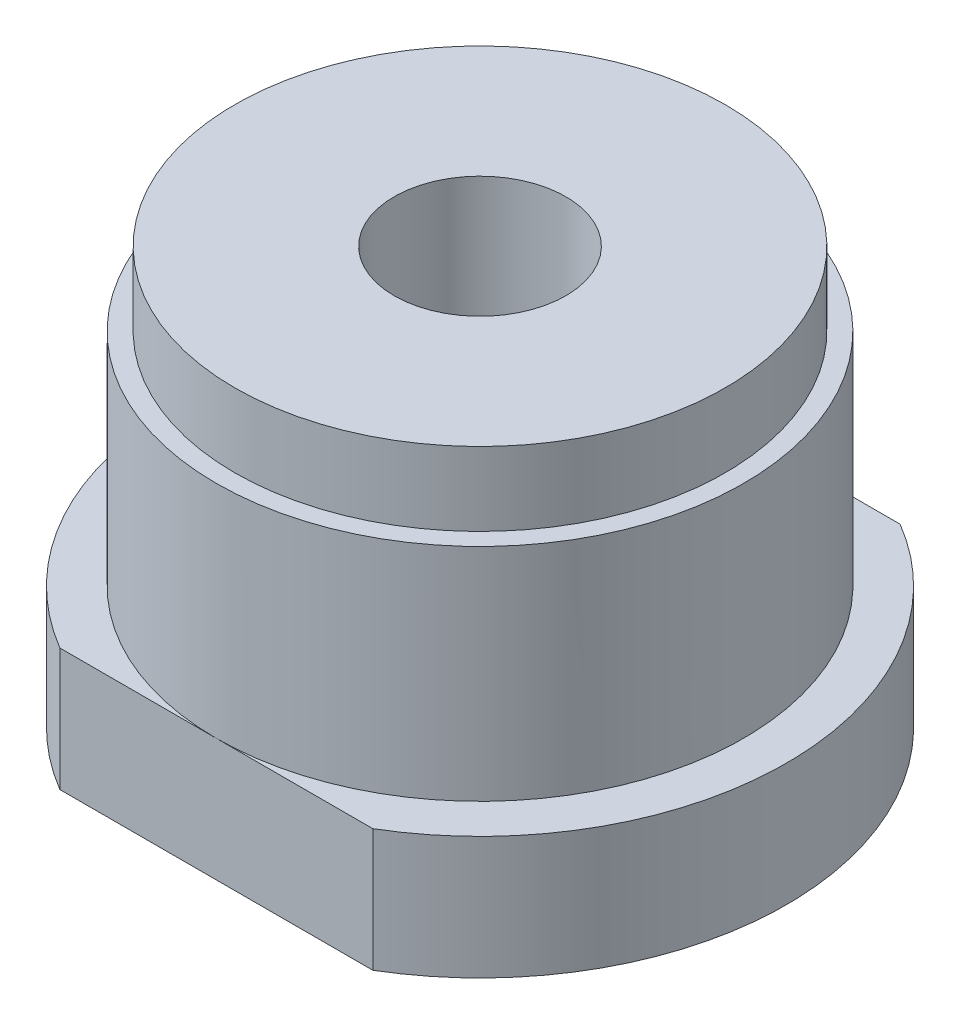
ISO-10303-21;
HEADER;
FILE_DESCRIPTION(('STEP AP214'),'2;1');
FILE_NAME('part.step','',(''),(''),'','','');
FILE_SCHEMA(('AUTOMOTIVE_DESIGN { 1 0 10303 214 1 1 1 1 }'));
ENDSEC;
DATA;
#1=APPLICATION_CONTEXT('core data for automotive mechanical design processes');
#2=APPLICATION_PROTOCOL_DEFINITION('international standard','automotive_design',2000,#1);
#3=PRODUCT_CONTEXT('',#1,'mechanical');
#4=PRODUCT('Part','Part','',(#3));
#5=PRODUCT_RELATED_PRODUCT_CATEGORY('part','',(#4));
#6=PRODUCT_DEFINITION_FORMATION('','',#4);
#7=PRODUCT_DEFINITION_CONTEXT('part definition',#1,'design');
#8=PRODUCT_DEFINITION('design','',#6,#7);
#9=PRODUCT_DEFINITION_SHAPE('','',#8);
#10=(LENGTH_UNIT() NAMED_UNIT(*) SI_UNIT(.MILLI.,.METRE.));
#11=(NAMED_UNIT(*) PLANE_ANGLE_UNIT() SI_UNIT($,.RADIAN.));
#12=(NAMED_UNIT(*) SI_UNIT($,.STERADIAN.) SOLID_ANGLE_UNIT());
#13=UNCERTAINTY_MEASURE_WITH_UNIT(LENGTH_MEASURE(1.E-05),#10,'distance_accuracy_value','');
#14=(GEOMETRIC_REPRESENTATION_CONTEXT(3) GLOBAL_UNCERTAINTY_ASSIGNED_CONTEXT((#13)) GLOBAL_UNIT_ASSIGNED_CONTEXT((#10,
#11,#12)) REPRESENTATION_CONTEXT('',''));
#15=CARTESIAN_POINT('',(0.,0.,0.));
#16=DIRECTION('',(0.,0.,1.));
#17=DIRECTION('',(1.,0.,0.));
#18=AXIS2_PLACEMENT_3D('',#15,#16,#17);
#19=CARTESIAN_POINT('',(0.,0.,0.));
#20=DIRECTION('',(0.,1.,0.));
#21=DIRECTION('',(0.,0.,1.));
#22=AXIS2_PLACEMENT_3D('',#19,#20,#21);
#23=PLANE('',#22);
#24=CARTESIAN_POINT('',(-8.,0.,0.));
#25=DIRECTION('',(0.,-1.,0.));
#26=DIRECTION('',(0.,0.,-1.));
#27=AXIS2_PLACEMENT_3D('',#24,#25,#26);
#28=CIRCLE('',#27,1.25);
#29=CARTESIAN_POINT('',(-8.,0.,-1.25));
#30=VERTEX_POINT('',#29);
#31=EDGE_CURVE('E148',#30,#30,#28,.T.);
#32=ORIENTED_EDGE('',*,*,#31,.F.);
#33=EDGE_LOOP('',(#32));
#34=FACE_BOUND('',#33,.T.);
#35=CARTESIAN_POINT('',(8.,0.,0.));
#36=DIRECTION('',(0.,1.,0.));
#37=DIRECTION('',(0.,0.,-1.));
#38=AXIS2_PLACEMENT_3D('',#35,#36,#37);
#39=CIRCLE('',#38,1.25);
#40=CARTESIAN_POINT('',(8.,0.,-1.25));
#41=VERTEX_POINT('',#40);
#42=EDGE_CURVE('E115',#41,#41,#39,.T.);
#43=ORIENTED_EDGE('',*,*,#42,.T.);
#44=EDGE_LOOP('',(#43));
#45=FACE_BOUND('',#44,.T.);
#46=DIRECTION('',(1.,0.,0.));
#47=VECTOR('',#46,1.);
#48=CARTESIAN_POINT('',(-11.0867579735155,0.,10.75));
#49=LINE('',#48,#47);
#50=CARTESIAN_POINT('',(-6.37867541108654,0.,10.75));
#51=VERTEX_POINT('',#50);
#52=CARTESIAN_POINT('',(6.37867541108654,0.,10.75));
#53=VERTEX_POINT('',#52);
#54=EDGE_CURVE('E323',#51,#53,#49,.T.);
#55=ORIENTED_EDGE('',*,*,#54,.F.);
#56=CARTESIAN_POINT('',(0.,0.,0.));
#57=DIRECTION('',(0.,1.,0.));
#58=DIRECTION('',(0.,0.,1.));
#59=AXIS2_PLACEMENT_3D('',#56,#57,#58);
#60=CIRCLE('',#59,12.5);
#61=CARTESIAN_POINT('',(-6.37867541108654,0.,-10.75));
#62=VERTEX_POINT('',#61);
#63=EDGE_CURVE('E96',#62,#51,#60,.T.);
#64=ORIENTED_EDGE('',*,*,#63,.F.);
#65=DIRECTION('',(1.,0.,0.));
#66=VECTOR('',#65,1.);
#67=CARTESIAN_POINT('',(-11.0867579735155,0.,-10.75));
#68=LINE('',#67,#66);
#69=CARTESIAN_POINT('',(6.37867541108654,0.,-10.75));
#70=VERTEX_POINT('',#69);
#71=EDGE_CURVE('E97',#62,#70,#68,.T.);
#72=ORIENTED_EDGE('',*,*,#71,.T.);
#73=EDGE_CURVE('E133',#53,#70,#60,.T.);
#74=ORIENTED_EDGE('',*,*,#73,.F.);
#75=EDGE_LOOP('',(#55,#64,#72,#74));
#76=FACE_BOUND('',#75,.T.);
#77=ADVANCED_FACE('F38',(#34,#45,#76),#23,.F.);
#78=CARTESIAN_POINT('',(0.,17.,0.));
#79=DIRECTION('',(0.,-1.,0.));
#80=DIRECTION('',(0.,0.,-1.));
#81=AXIS2_PLACEMENT_3D('',#78,#79,#80);
#82=CYLINDRICAL_SURFACE('',#81,12.5);
#83=DIRECTION('',(0.,-1.,0.));
#84=VECTOR('',#83,1.);
#85=CARTESIAN_POINT('',(-6.37867541108654,17.,10.75));
#86=LINE('',#85,#84);
#87=CARTESIAN_POINT('',(-6.37867541108654,5.,10.75));
#88=VERTEX_POINT('',#87);
#89=EDGE_CURVE('E85',#88,#51,#86,.T.);
#90=ORIENTED_EDGE('',*,*,#89,.F.);
#91=CARTESIAN_POINT('',(0.,5.,0.));
#92=DIRECTION('',(0.,1.,0.));
#93=DIRECTION('',(0.,0.,1.));
#94=AXIS2_PLACEMENT_3D('',#91,#92,#93);
#95=CIRCLE('',#94,12.5);
#96=CARTESIAN_POINT('',(-6.37867541108654,5.,-10.75));
#97=VERTEX_POINT('',#96);
#98=EDGE_CURVE('E94',#97,#88,#95,.T.);
#99=ORIENTED_EDGE('',*,*,#98,.F.);
#100=DIRECTION('',(0.,-1.,0.));
#101=VECTOR('',#100,1.);
#102=CARTESIAN_POINT('',(-6.37867541108654,17.,-10.75));
#103=LINE('',#102,#101);
#104=EDGE_CURVE('E135',#97,#62,#103,.T.);
#105=ORIENTED_EDGE('',*,*,#104,.T.);
#106=ORIENTED_EDGE('',*,*,#63,.T.);
#107=EDGE_LOOP('',(#90,#99,#105,#106));
#108=FACE_BOUND('',#107,.T.);
#109=ADVANCED_FACE('F40',(#108),#82,.T.);
#110=DIRECTION('',(0.,-1.,0.));
#111=VECTOR('',#110,1.);
#112=CARTESIAN_POINT('',(6.37867541108654,17.,10.75));
#113=LINE('',#112,#111);
#114=CARTESIAN_POINT('',(6.37867541108654,5.,10.75));
#115=VERTEX_POINT('',#114);
#116=EDGE_CURVE('E53',#53,#115,#113,.F.);
#117=ORIENTED_EDGE('',*,*,#116,.F.);
#118=ORIENTED_EDGE('',*,*,#73,.T.);
#119=DIRECTION('',(0.,-1.,0.));
#120=VECTOR('',#119,1.);
#121=CARTESIAN_POINT('',(6.37867541108654,17.,-10.75));
#122=LINE('',#121,#120);
#123=CARTESIAN_POINT('',(6.37867541108654,5.,-10.75));
#124=VERTEX_POINT('',#123);
#125=EDGE_CURVE('E132',#70,#124,#122,.F.);
#126=ORIENTED_EDGE('',*,*,#125,.T.);
#127=EDGE_CURVE('E103',#115,#124,#95,.T.);
#128=ORIENTED_EDGE('',*,*,#127,.F.);
#129=EDGE_LOOP('',(#117,#118,#126,#128));
#130=FACE_BOUND('',#129,.T.);
#131=ADVANCED_FACE('F130',(#130),#82,.T.);
#132=CARTESIAN_POINT('',(0.,5.,0.));
#133=DIRECTION('',(0.,1.,0.));
#134=DIRECTION('',(0.,0.,1.));
#135=AXIS2_PLACEMENT_3D('',#132,#133,#134);
#136=PLANE('',#135);
#137=ORIENTED_EDGE('',*,*,#98,.T.);
#138=DIRECTION('',(1.,0.,0.));
#139=VECTOR('',#138,1.);
#140=CARTESIAN_POINT('',(0.,5.,10.75));
#141=LINE('',#140,#139);
#142=CARTESIAN_POINT('',(0.,5.,10.75));
#143=VERTEX_POINT('',#142);
#144=EDGE_CURVE('E13',#88,#143,#141,.T.);
#145=ORIENTED_EDGE('',*,*,#144,.T.);
#146=CARTESIAN_POINT('',(0.,5.,0.));
#147=DIRECTION('',(0.,1.,0.));
#148=DIRECTION('',(0.,0.,1.));
#149=AXIS2_PLACEMENT_3D('',#146,#147,#148);
#150=CIRCLE('',#149,10.75);
#151=CARTESIAN_POINT('',(0.,5.,-10.75));
#152=VERTEX_POINT('',#151);
#153=EDGE_CURVE('E142',#152,#143,#150,.T.);
#154=ORIENTED_EDGE('',*,*,#153,.F.);
#155=DIRECTION('',(1.,0.,0.));
#156=VECTOR('',#155,1.);
#157=CARTESIAN_POINT('',(0.,5.,-10.75));
#158=LINE('',#157,#156);
#159=EDGE_CURVE('E101',#97,#152,#158,.T.);
#160=ORIENTED_EDGE('',*,*,#159,.F.);
#161=EDGE_LOOP('',(#137,#145,#154,#160));
#162=FACE_BOUND('',#161,.T.);
#163=ADVANCED_FACE('F100',(#162),#136,.T.);
#164=EDGE_CURVE('E60',#143,#152,#150,.T.);
#165=ORIENTED_EDGE('',*,*,#164,.F.);
#166=EDGE_CURVE('E42',#143,#115,#141,.T.);
#167=ORIENTED_EDGE('',*,*,#166,.T.);
#168=ORIENTED_EDGE('',*,*,#127,.T.);
#169=EDGE_CURVE('E119',#152,#124,#158,.T.);
#170=ORIENTED_EDGE('',*,*,#169,.F.);
#171=EDGE_LOOP('',(#165,#167,#168,#170));
#172=FACE_BOUND('',#171,.T.);
#173=ADVANCED_FACE('F128',(#172),#136,.T.);
#174=CARTESIAN_POINT('',(0.,17.,0.));
#175=DIRECTION('',(0.,1.,0.));
#176=DIRECTION('',(0.,0.,1.));
#177=AXIS2_PLACEMENT_3D('',#174,#175,#176);
#178=PLANE('',#177);
#179=CARTESIAN_POINT('',(0.,17.,0.));
#180=DIRECTION('',(0.,1.,0.));
#181=DIRECTION('',(0.,0.,1.));
#182=AXIS2_PLACEMENT_3D('',#179,#180,#181);
#183=CIRCLE('',#182,3.5);
#184=CARTESIAN_POINT('',(0.,17.,3.5));
#185=VERTEX_POINT('',#184);
#186=EDGE_CURVE('E102',#185,#185,#183,.T.);
#187=ORIENTED_EDGE('',*,*,#186,.F.);
#188=EDGE_LOOP('',(#187));
#189=FACE_BOUND('',#188,.T.);
#190=CARTESIAN_POINT('',(0.,17.,0.));
#191=DIRECTION('',(0.,1.,0.));
#192=DIRECTION('',(0.,0.,1.));
#193=AXIS2_PLACEMENT_3D('',#190,#191,#192);
#194=CIRCLE('',#193,10.);
#195=CARTESIAN_POINT('',(0.,17.,10.));
#196=VERTEX_POINT('',#195);
#197=EDGE_CURVE('E108',#196,#196,#194,.T.);
#198=ORIENTED_EDGE('',*,*,#197,.T.);
#199=EDGE_LOOP('',(#198));
#200=FACE_BOUND('',#199,.T.);
#201=ADVANCED_FACE('F169',(#189,#200),#178,.T.);
#202=CARTESIAN_POINT('',(0.,-9.89949493661167,0.));
#203=DIRECTION('',(0.,1.,0.));
#204=DIRECTION('',(0.,0.,1.));
#205=AXIS2_PLACEMENT_3D('',#202,#203,#204);
#206=CYLINDRICAL_SURFACE('',#205,3.5);
#207=CARTESIAN_POINT('',(0.,2.,0.));
#208=DIRECTION('',(0.,1.,0.));
#209=DIRECTION('',(0.,0.,1.));
#210=AXIS2_PLACEMENT_3D('',#207,#208,#209);
#211=CIRCLE('',#210,3.5);
#212=CARTESIAN_POINT('',(0.,2.,3.5));
#213=VERTEX_POINT('',#212);
#214=EDGE_CURVE('E106',#213,#213,#211,.F.);
#215=CARTESIAN_POINT('',(0.,2.,3.5));
#216=CARTESIAN_POINT('',(0.,2.15625,3.5));
#217=CARTESIAN_POINT('',(0.,2.3125,3.5));
#218=CARTESIAN_POINT('',(0.,2.625,3.5));
#219=CARTESIAN_POINT('',(0.,2.78125,3.5));
#220=CARTESIAN_POINT('',(0.,3.09375,3.5));
#221=CARTESIAN_POINT('',(0.,3.25,3.5));
#222=CARTESIAN_POINT('',(0.,3.5625,3.5));
#223=CARTESIAN_POINT('',(0.,3.71875,3.5));
#224=CARTESIAN_POINT('',(0.,4.03125,3.5));
#225=CARTESIAN_POINT('',(0.,4.1875,3.5));
#226=CARTESIAN_POINT('',(0.,4.5,3.5));
#227=CARTESIAN_POINT('',(0.,4.65625,3.5));
#228=CARTESIAN_POINT('',(0.,4.96875,3.5));
#229=CARTESIAN_POINT('',(0.,5.125,3.5));
#230=CARTESIAN_POINT('',(0.,5.4375,3.5));
#231=CARTESIAN_POINT('',(0.,5.59375,3.5));
#232=CARTESIAN_POINT('',(0.,5.90625,3.5));
#233=CARTESIAN_POINT('',(0.,6.0625,3.5));
#234=CARTESIAN_POINT('',(0.,6.375,3.5));
#235=CARTESIAN_POINT('',(0.,6.53125,3.5));
#236=CARTESIAN_POINT('',(0.,6.84375,3.5));
#237=CARTESIAN_POINT('',(0.,7.,3.5));
#238=CARTESIAN_POINT('',(0.,7.3125,3.5));
#239=CARTESIAN_POINT('',(0.,7.46875,3.5));
#240=CARTESIAN_POINT('',(0.,7.78125,3.5));
#241=CARTESIAN_POINT('',(0.,7.9375,3.5));
#242=CARTESIAN_POINT('',(0.,8.25,3.5));
#243=CARTESIAN_POINT('',(0.,8.40625,3.5));
#244=CARTESIAN_POINT('',(0.,8.71875,3.5));
#245=CARTESIAN_POINT('',(0.,8.875,3.5));
#246=CARTESIAN_POINT('',(0.,9.1875,3.5));
#247=CARTESIAN_POINT('',(0.,9.34375,3.5));
#248=CARTESIAN_POINT('',(0.,9.65625,3.5));
#249=CARTESIAN_POINT('',(0.,9.8125,3.5));
#250=CARTESIAN_POINT('',(0.,10.125,3.5));
#251=CARTESIAN_POINT('',(0.,10.28125,3.5));
#252=CARTESIAN_POINT('',(0.,10.59375,3.5));
#253=CARTESIAN_POINT('',(0.,10.75,3.5));
#254=CARTESIAN_POINT('',(0.,11.0625,3.5));
#255=CARTESIAN_POINT('',(0.,11.21875,3.5));
#256=CARTESIAN_POINT('',(0.,11.53125,3.5));
#257=CARTESIAN_POINT('',(0.,11.6875,3.5));
#258=CARTESIAN_POINT('',(0.,12.,3.5));
#259=CARTESIAN_POINT('',(0.,12.15625,3.5));
#260=CARTESIAN_POINT('',(0.,12.46875,3.5));
#261=CARTESIAN_POINT('',(0.,12.625,3.5));
#262=CARTESIAN_POINT('',(0.,12.9375,3.5));
#263=CARTESIAN_POINT('',(0.,13.09375,3.5));
#264=CARTESIAN_POINT('',(0.,13.40625,3.5));
#265=CARTESIAN_POINT('',(0.,13.5625,3.5));
#266=CARTESIAN_POINT('',(0.,13.875,3.5));
#267=CARTESIAN_POINT('',(0.,14.03125,3.5));
#268=CARTESIAN_POINT('',(0.,14.34375,3.5));
#269=CARTESIAN_POINT('',(0.,14.5,3.5));
#270=CARTESIAN_POINT('',(0.,14.8125,3.5));
#271=CARTESIAN_POINT('',(0.,14.96875,3.5));
#272=CARTESIAN_POINT('',(0.,15.28125,3.5));
#273=CARTESIAN_POINT('',(0.,15.4375,3.5));
#274=CARTESIAN_POINT('',(0.,15.75,3.5));
#275=CARTESIAN_POINT('',(0.,15.90625,3.5));
#276=CARTESIAN_POINT('',(0.,16.21875,3.5));
#277=CARTESIAN_POINT('',(0.,16.375,3.5));
#278=CARTESIAN_POINT('',(0.,16.6875,3.5));
#279=CARTESIAN_POINT('',(0.,16.84375,3.5));
#280=CARTESIAN_POINT('',(0.,17.,3.5));
#281=B_SPLINE_CURVE_WITH_KNOTS('',3,(#215,#216,#217,#218,#219,#220,#221,#222,#223,#224,#225,
#226,#227,#228,#229,#230,#231,#232,#233,#234,#235,#236,#237,#238,#239,#240,#241,#242,#243,#244,
#245,#246,#247,#248,#249,#250,#251,#252,#253,#254,#255,#256,#257,#258,#259,#260,#261,#262,#263,
#264,#265,#266,#267,#268,#269,#270,#271,#272,#273,#274,#275,#276,#277,#278,#279,#280),
.UNSPECIFIED.,.F.,.F.,(4,2,2,2,2,2,2,2,2,2,2,2,2,2,2,2,2,2,2,2,2,2,2,2,2,2,2,2,2,2,2,2,4),(0.,
0.46875,0.937500000000001,1.40625,1.875,2.34375,2.8125,3.28125,3.75,4.21875,4.6875,5.15625,
5.625,6.09375,6.5625,7.03125,7.5,7.96875,8.4375,8.90625,9.375,9.84375,10.3125,10.78125,11.25,
11.71875,12.1875,12.65625,13.125,13.59375,14.0625,14.53125,15.),.UNSPECIFIED.);
#282=EDGE_CURVE('BSEAM155',#213,#185,#281,.T.);
#283=ORIENTED_EDGE('',*,*,#214,.T.);
#284=ORIENTED_EDGE('',*,*,#186,.T.);
#285=ORIENTED_EDGE('',*,*,#282,.T.);
#286=ORIENTED_EDGE('',*,*,#282,.F.);
#287=EDGE_LOOP('',(#283,#285,#284,#286));
#288=FACE_BOUND('',#287,.T.);
#289=ADVANCED_FACE('F155',(#288),#206,.F.);
#290=CARTESIAN_POINT('',(0.,2.,0.));
#291=DIRECTION('',(0.,1.,0.));
#292=DIRECTION('',(0.,0.,1.));
#293=AXIS2_PLACEMENT_3D('',#290,#291,#292);
#294=PLANE('',#293);
#295=ORIENTED_EDGE('',*,*,#214,.F.);
#296=EDGE_LOOP('',(#295));
#297=FACE_BOUND('',#296,.T.);
#298=ADVANCED_FACE('F158',(#297),#294,.T.);
#299=CARTESIAN_POINT('',(0.,-35.7088924499207,0.));
#300=DIRECTION('',(0.,1.,0.));
#301=DIRECTION('',(0.,0.,1.));
#302=AXIS2_PLACEMENT_3D('',#299,#300,#301);
#303=CYLINDRICAL_SURFACE('',#302,10.);
#304=CARTESIAN_POINT('',(0.,14.,0.));
#305=DIRECTION('',(0.,1.,0.));
#306=DIRECTION('',(0.,0.,1.));
#307=AXIS2_PLACEMENT_3D('',#304,#305,#306);
#308=CIRCLE('',#307,10.);
#309=CARTESIAN_POINT('',(0.,14.,10.));
#310=VERTEX_POINT('',#309);
#311=EDGE_CURVE('E117',#310,#310,#308,.F.);
#312=CARTESIAN_POINT('',(0.,14.,10.));
#313=CARTESIAN_POINT('',(0.,14.03125,10.));
#314=CARTESIAN_POINT('',(0.,14.0625,10.));
#315=CARTESIAN_POINT('',(0.,14.125,10.));
#316=CARTESIAN_POINT('',(0.,14.15625,10.));
#317=CARTESIAN_POINT('',(0.,14.21875,10.));
#318=CARTESIAN_POINT('',(0.,14.25,10.));
#319=CARTESIAN_POINT('',(0.,14.3125,10.));
#320=CARTESIAN_POINT('',(0.,14.34375,10.));
#321=CARTESIAN_POINT('',(0.,14.40625,10.));
#322=CARTESIAN_POINT('',(0.,14.4375,10.));
#323=CARTESIAN_POINT('',(0.,14.5,10.));
#324=CARTESIAN_POINT('',(0.,14.53125,10.));
#325=CARTESIAN_POINT('',(0.,14.59375,10.));
#326=CARTESIAN_POINT('',(0.,14.625,10.));
#327=CARTESIAN_POINT('',(0.,14.6875,10.));
#328=CARTESIAN_POINT('',(0.,14.71875,10.));
#329=CARTESIAN_POINT('',(0.,14.78125,10.));
#330=CARTESIAN_POINT('',(0.,14.8125,10.));
#331=CARTESIAN_POINT('',(0.,14.875,10.));
#332=CARTESIAN_POINT('',(0.,14.90625,10.));
#333=CARTESIAN_POINT('',(0.,14.96875,10.));
#334=CARTESIAN_POINT('',(0.,15.,10.));
#335=CARTESIAN_POINT('',(0.,15.0625,10.));
#336=CARTESIAN_POINT('',(0.,15.09375,10.));
#337=CARTESIAN_POINT('',(0.,15.15625,10.));
#338=CARTESIAN_POINT('',(0.,15.1875,10.));
#339=CARTESIAN_POINT('',(0.,15.25,10.));
#340=CARTESIAN_POINT('',(0.,15.28125,10.));
#341=CARTESIAN_POINT('',(0.,15.34375,10.));
#342=CARTESIAN_POINT('',(0.,15.375,10.));
#343=CARTESIAN_POINT('',(0.,15.4375,10.));
#344=CARTESIAN_POINT('',(0.,15.46875,10.));
#345=CARTESIAN_POINT('',(0.,15.53125,10.));
#346=CARTESIAN_POINT('',(0.,15.5625,10.));
#347=CARTESIAN_POINT('',(0.,15.625,10.));
#348=CARTESIAN_POINT('',(0.,15.65625,10.));
#349=CARTESIAN_POINT('',(0.,15.71875,10.));
#350=CARTESIAN_POINT('',(0.,15.75,10.));
#351=CARTESIAN_POINT('',(0.,15.8125,10.));
#352=CARTESIAN_POINT('',(0.,15.84375,10.));
#353=CARTESIAN_POINT('',(0.,15.90625,10.));
#354=CARTESIAN_POINT('',(0.,15.9375,10.));
#355=CARTESIAN_POINT('',(0.,16.,10.));
#356=CARTESIAN_POINT('',(0.,16.03125,10.));
#357=CARTESIAN_POINT('',(0.,16.09375,10.));
#358=CARTESIAN_POINT('',(0.,16.125,10.));
#359=CARTESIAN_POINT('',(0.,16.1875,10.));
#360=CARTESIAN_POINT('',(0.,16.21875,10.));
#361=CARTESIAN_POINT('',(0.,16.28125,10.));
#362=CARTESIAN_POINT('',(0.,16.3125,10.));
#363=CARTESIAN_POINT('',(0.,16.375,10.));
#364=CARTESIAN_POINT('',(0.,16.40625,10.));
#365=CARTESIAN_POINT('',(0.,16.46875,10.));
#366=CARTESIAN_POINT('',(0.,16.5,10.));
#367=CARTESIAN_POINT('',(0.,16.5625,10.));
#368=CARTESIAN_POINT('',(0.,16.59375,10.));
#369=CARTESIAN_POINT('',(0.,16.65625,10.));
#370=CARTESIAN_POINT('',(0.,16.6875,10.));
#371=CARTESIAN_POINT('',(0.,16.75,10.));
#372=CARTESIAN_POINT('',(0.,16.78125,10.));
#373=CARTESIAN_POINT('',(0.,16.84375,10.));
#374=CARTESIAN_POINT('',(0.,16.875,10.));
#375=CARTESIAN_POINT('',(0.,16.9375,10.));
#376=CARTESIAN_POINT('',(0.,16.96875,10.));
#377=CARTESIAN_POINT('',(0.,17.,10.));
#378=B_SPLINE_CURVE_WITH_KNOTS('',3,(#312,#313,#314,#315,#316,#317,#318,#319,#320,#321,#322,
#323,#324,#325,#326,#327,#328,#329,#330,#331,#332,#333,#334,#335,#336,#337,#338,#339,#340,#341,
#342,#343,#344,#345,#346,#347,#348,#349,#350,#351,#352,#353,#354,#355,#356,#357,#358,#359,#360,
#361,#362,#363,#364,#365,#366,#367,#368,#369,#370,#371,#372,#373,#374,#375,#376,#377),
.UNSPECIFIED.,.F.,.F.,(4,2,2,2,2,2,2,2,2,2,2,2,2,2,2,2,2,2,2,2,2,2,2,2,2,2,2,2,2,2,2,2,4),(0.,
0.0937500000000036,0.1875,0.281249999999997,0.375,0.468750000000004,0.5625,0.656249999999997,
0.750000000000001,0.843750000000004,0.937500000000001,1.03125,1.125,1.21875,1.3125,1.40625,1.5,
1.59375,1.6875,1.78125,1.875,1.96875000000001,2.0625,2.15625,2.25,2.34375000000001,2.4375,
2.53125,2.625,2.71875000000001,2.8125,2.90625,3.),.UNSPECIFIED.);
#379=EDGE_CURVE('BSEAM160',#310,#196,#378,.T.);
#380=ORIENTED_EDGE('',*,*,#311,.F.);
#381=ORIENTED_EDGE('',*,*,#197,.F.);
#382=ORIENTED_EDGE('',*,*,#379,.T.);
#383=ORIENTED_EDGE('',*,*,#379,.F.);
#384=EDGE_LOOP('',(#380,#382,#381,#383));
#385=FACE_BOUND('',#384,.T.);
#386=ADVANCED_FACE('F160',(#385),#303,.T.);
#387=CARTESIAN_POINT('',(0.,14.,0.));
#388=DIRECTION('',(0.,1.,0.));
#389=DIRECTION('',(0.,0.,1.));
#390=AXIS2_PLACEMENT_3D('',#387,#388,#389);
#391=PLANE('',#390);
#392=ORIENTED_EDGE('',*,*,#311,.T.);
#393=EDGE_LOOP('',(#392));
#394=FACE_BOUND('',#393,.T.);
#395=CARTESIAN_POINT('',(0.,14.,0.));
#396=DIRECTION('',(0.,1.,0.));
#397=DIRECTION('',(0.,0.,1.));
#398=AXIS2_PLACEMENT_3D('',#395,#396,#397);
#399=CIRCLE('',#398,10.75);
#400=CARTESIAN_POINT('',(0.,14.,10.75));
#401=VERTEX_POINT('',#400);
#402=EDGE_CURVE('E116',#401,#401,#399,.T.);
#403=ORIENTED_EDGE('',*,*,#402,.T.);
#404=EDGE_LOOP('',(#403));
#405=FACE_BOUND('',#404,.T.);
#406=ADVANCED_FACE('F166',(#394,#405),#391,.T.);
#407=CARTESIAN_POINT('',(0.,14.,0.));
#408=DIRECTION('',(0.,-1.,0.));
#409=DIRECTION('',(0.,0.,-1.));
#410=AXIS2_PLACEMENT_3D('',#407,#408,#409);
#411=CYLINDRICAL_SURFACE('',#410,10.75);
#412=ORIENTED_EDGE('',*,*,#402,.F.);
#413=EDGE_LOOP('',(#412));
#414=FACE_BOUND('',#413,.T.);
#415=ORIENTED_EDGE('',*,*,#153,.T.);
#416=ORIENTED_EDGE('',*,*,#164,.T.);
#417=EDGE_LOOP('',(#415,#416));
#418=FACE_BOUND('',#417,.T.);
#419=ADVANCED_FACE('F197',(#414,#418),#411,.T.);
#420=CARTESIAN_POINT('',(-8.,10.,0.));
#421=DIRECTION('',(0.,-1.,0.));
#422=DIRECTION('',(0.,0.,-1.));
#423=AXIS2_PLACEMENT_3D('',#420,#421,#422);
#424=CYLINDRICAL_SURFACE('',#423,1.25);
#425=ORIENTED_EDGE('',*,*,#31,.T.);
#426=EDGE_LOOP('',(#425));
#427=FACE_BOUND('',#426,.T.);
#428=CARTESIAN_POINT('',(-8.,5.,0.));
#429=DIRECTION('',(0.,1.,0.));
#430=DIRECTION('',(0.,0.,1.));
#431=AXIS2_PLACEMENT_3D('',#428,#429,#430);
#432=CIRCLE('',#431,1.25);
#433=CARTESIAN_POINT('',(-8.,5.,1.25));
#434=VERTEX_POINT('',#433);
#435=EDGE_CURVE('E120',#434,#434,#432,.F.);
#436=ORIENTED_EDGE('',*,*,#435,.F.);
#437=EDGE_LOOP('',(#436));
#438=FACE_BOUND('',#437,.T.);
#439=ADVANCED_FACE('F193',(#427,#438),#424,.F.);
#440=CARTESIAN_POINT('',(8.,10.,0.));
#441=DIRECTION('',(0.,-1.,0.));
#442=DIRECTION('',(0.,0.,-1.));
#443=AXIS2_PLACEMENT_3D('',#440,#441,#442);
#444=CYLINDRICAL_SURFACE('',#443,1.25);
#445=ORIENTED_EDGE('',*,*,#42,.F.);
#446=EDGE_LOOP('',(#445));
#447=FACE_BOUND('',#446,.T.);
#448=CARTESIAN_POINT('',(8.,5.,0.));
#449=DIRECTION('',(0.,1.,0.));
#450=DIRECTION('',(0.,0.,1.));
#451=AXIS2_PLACEMENT_3D('',#448,#449,#450);
#452=CIRCLE('',#451,1.25);
#453=CARTESIAN_POINT('',(8.,5.,1.25));
#454=VERTEX_POINT('',#453);
#455=EDGE_CURVE('E112',#454,#454,#452,.T.);
#456=ORIENTED_EDGE('',*,*,#455,.T.);
#457=EDGE_LOOP('',(#456));
#458=FACE_BOUND('',#457,.T.);
#459=ADVANCED_FACE('F196',(#447,#458),#444,.F.);
#460=CARTESIAN_POINT('',(0.,5.,0.));
#461=DIRECTION('',(0.,1.,0.));
#462=DIRECTION('',(0.,0.,1.));
#463=AXIS2_PLACEMENT_3D('',#460,#461,#462);
#464=PLANE('',#463);
#465=ORIENTED_EDGE('',*,*,#455,.F.);
#466=EDGE_LOOP('',(#465));
#467=FACE_BOUND('',#466,.T.);
#468=ADVANCED_FACE('F201',(#467),#464,.F.);
#469=ORIENTED_EDGE('',*,*,#435,.T.);
#470=EDGE_LOOP('',(#469));
#471=FACE_BOUND('',#470,.T.);
#472=ADVANCED_FACE('F206',(#471),#464,.F.);
#473=CARTESIAN_POINT('',(-11.0867579735155,0.,-10.75));
#474=DIRECTION('',(0.,0.,1.));
#475=DIRECTION('',(1.,0.,0.));
#476=AXIS2_PLACEMENT_3D('',#473,#474,#475);
#477=PLANE('',#476);
#478=ORIENTED_EDGE('',*,*,#159,.T.);
#479=ORIENTED_EDGE('',*,*,#169,.T.);
#480=ORIENTED_EDGE('',*,*,#125,.F.);
#481=ORIENTED_EDGE('',*,*,#71,.F.);
#482=ORIENTED_EDGE('',*,*,#104,.F.);
#483=EDGE_LOOP('',(#478,#479,#480,#481,#482));
#484=FACE_BOUND('',#483,.T.);
#485=ADVANCED_FACE('F209',(#484),#477,.F.);
#486=CARTESIAN_POINT('',(-11.0867579735155,0.,10.75));
#487=DIRECTION('',(0.,0.,1.));
#488=DIRECTION('',(1.,0.,0.));
#489=AXIS2_PLACEMENT_3D('',#486,#487,#488);
#490=PLANE('',#489);
#491=ORIENTED_EDGE('',*,*,#89,.T.);
#492=ORIENTED_EDGE('',*,*,#54,.T.);
#493=ORIENTED_EDGE('',*,*,#116,.T.);
#494=ORIENTED_EDGE('',*,*,#166,.F.);
#495=ORIENTED_EDGE('',*,*,#144,.F.);
#496=EDGE_LOOP('',(#491,#492,#493,#494,#495));
#497=FACE_BOUND('',#496,.T.);
#498=ADVANCED_FACE('F84',(#497),#490,.T.);
#499=CLOSED_SHELL('',(#77,#109,#131,#163,#173,#201,#289,#298,#386,#406,#419,#439,#459,#468,#472,
#485,#498));
#500=MANIFOLD_SOLID_BREP('B2',#499);
#501=ADVANCED_BREP_SHAPE_REPRESENTATION('',(#18,#500),#14);
#502=SHAPE_DEFINITION_REPRESENTATION(#9,#501);
ENDSEC;
END-ISO-10303-21;
